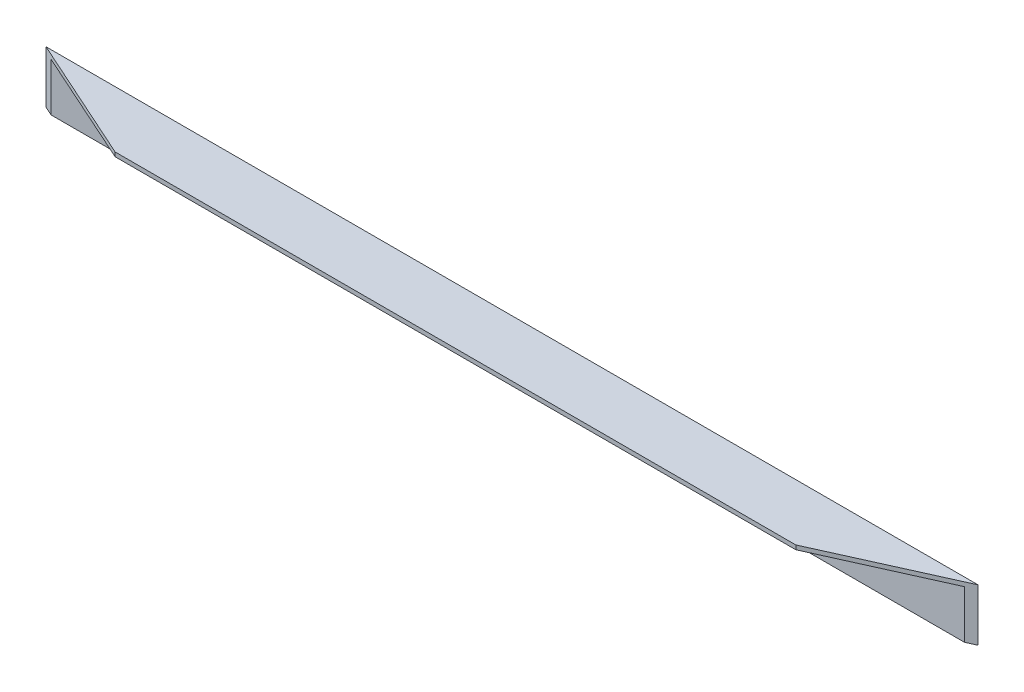
ISO-10303-21;
HEADER;
FILE_DESCRIPTION(('STEP AP214'),'2;1');
FILE_NAME('part.step','',(''),(''),'','','');
FILE_SCHEMA(('AUTOMOTIVE_DESIGN { 1 0 10303 214 1 1 1 1 }'));
ENDSEC;
DATA;
#1=APPLICATION_CONTEXT('core data for automotive mechanical design processes');
#2=APPLICATION_PROTOCOL_DEFINITION('international standard','automotive_design',2000,#1);
#3=PRODUCT_CONTEXT('',#1,'mechanical');
#4=PRODUCT('Part','Part','',(#3));
#5=PRODUCT_RELATED_PRODUCT_CATEGORY('part','',(#4));
#6=PRODUCT_DEFINITION_FORMATION('','',#4);
#7=PRODUCT_DEFINITION_CONTEXT('part definition',#1,'design');
#8=PRODUCT_DEFINITION('design','',#6,#7);
#9=PRODUCT_DEFINITION_SHAPE('','',#8);
#10=(LENGTH_UNIT() NAMED_UNIT(*) SI_UNIT(.MILLI.,.METRE.));
#11=(NAMED_UNIT(*) PLANE_ANGLE_UNIT() SI_UNIT($,.RADIAN.));
#12=(NAMED_UNIT(*) SI_UNIT($,.STERADIAN.) SOLID_ANGLE_UNIT());
#13=UNCERTAINTY_MEASURE_WITH_UNIT(LENGTH_MEASURE(1.E-05),#10,'distance_accuracy_value','');
#14=(GEOMETRIC_REPRESENTATION_CONTEXT(3) GLOBAL_UNCERTAINTY_ASSIGNED_CONTEXT((#13)) GLOBAL_UNIT_ASSIGNED_CONTEXT((#10,
#11,#12)) REPRESENTATION_CONTEXT('',''));
#15=CARTESIAN_POINT('',(0.,0.,0.));
#16=DIRECTION('',(0.,0.,1.));
#17=DIRECTION('',(1.,0.,0.));
#18=AXIS2_PLACEMENT_3D('',#15,#16,#17);
#19=CARTESIAN_POINT('',(-890.,100.,8.));
#20=DIRECTION('',(0.,0.,-1.));
#21=DIRECTION('',(-1.,0.,0.));
#22=AXIS2_PLACEMENT_3D('',#19,#20,#21);
#23=PLANE('',#22);
#24=DIRECTION('',(1.,0.,0.));
#25=VECTOR('',#24,1.);
#26=CARTESIAN_POINT('',(-890.,92.,8.));
#27=LINE('',#26,#25);
#28=CARTESIAN_POINT('',(-872.222222222222,92.,8.));
#29=VERTEX_POINT('',#28);
#30=CARTESIAN_POINT('',(872.222222222222,92.,8.));
#31=VERTEX_POINT('',#30);
#32=EDGE_CURVE('E36',#29,#31,#27,.T.);
#33=ORIENTED_EDGE('',*,*,#32,.F.);
#34=DIRECTION('',(0.,-1.,0.));
#35=VECTOR('',#34,1.);
#36=CARTESIAN_POINT('',(-872.222222222222,100.,8.));
#37=LINE('',#36,#35);
#38=CARTESIAN_POINT('',(-872.222222222222,0.,8.));
#39=VERTEX_POINT('',#38);
#40=EDGE_CURVE('E140',#29,#39,#37,.T.);
#41=ORIENTED_EDGE('',*,*,#40,.T.);
#42=DIRECTION('',(1.,0.,0.));
#43=VECTOR('',#42,1.);
#44=CARTESIAN_POINT('',(-890.,0.,8.));
#45=LINE('',#44,#43);
#46=CARTESIAN_POINT('',(872.222222222222,0.,8.));
#47=VERTEX_POINT('',#46);
#48=EDGE_CURVE('E109',#39,#47,#45,.T.);
#49=ORIENTED_EDGE('',*,*,#48,.T.);
#50=DIRECTION('',(0.,1.,0.));
#51=VECTOR('',#50,1.);
#52=CARTESIAN_POINT('',(872.222222222222,100.,8.));
#53=LINE('',#52,#51);
#54=EDGE_CURVE('E125',#47,#31,#53,.T.);
#55=ORIENTED_EDGE('',*,*,#54,.T.);
#56=EDGE_LOOP('',(#33,#41,#49,#55));
#57=FACE_BOUND('',#56,.T.);
#58=ADVANCED_FACE('F32',(#57),#23,.F.);
#59=CARTESIAN_POINT('',(-890.,0.,8.));
#60=DIRECTION('',(0.,1.,0.));
#61=DIRECTION('',(0.,0.,1.));
#62=AXIS2_PLACEMENT_3D('',#59,#60,#61);
#63=PLANE('',#62);
#64=ORIENTED_EDGE('',*,*,#48,.F.);
#65=DIRECTION('',(-0.911921505175107,0.,-0.410364677328798));
#66=VECTOR('',#65,1.);
#67=CARTESIAN_POINT('',(-887.006237006237,0.,1.34719334719335));
#68=LINE('',#67,#66);
#69=CARTESIAN_POINT('',(-890.,0.,0.));
#70=VERTEX_POINT('',#69);
#71=EDGE_CURVE('E129',#39,#70,#68,.T.);
#72=ORIENTED_EDGE('',*,*,#71,.T.);
#73=DIRECTION('',(1.,0.,0.));
#74=VECTOR('',#73,1.);
#75=CARTESIAN_POINT('',(-890.,0.,0.));
#76=LINE('',#75,#74);
#77=CARTESIAN_POINT('',(890.,0.,0.));
#78=VERTEX_POINT('',#77);
#79=EDGE_CURVE('E103',#70,#78,#76,.T.);
#80=ORIENTED_EDGE('',*,*,#79,.T.);
#81=DIRECTION('',(-0.911921505175107,0.,0.410364677328798));
#82=VECTOR('',#81,1.);
#83=CARTESIAN_POINT('',(-593.243243243243,0.,667.459459459459));
#84=LINE('',#83,#82);
#85=EDGE_CURVE('E127',#78,#47,#84,.T.);
#86=ORIENTED_EDGE('',*,*,#85,.T.);
#87=EDGE_LOOP('',(#64,#72,#80,#86));
#88=FACE_BOUND('',#87,.T.);
#89=ADVANCED_FACE('F34',(#88),#63,.F.);
#90=CARTESIAN_POINT('',(-890.,100.,8.));
#91=DIRECTION('',(0.,-1.,0.));
#92=DIRECTION('',(0.,0.,-1.));
#93=AXIS2_PLACEMENT_3D('',#90,#91,#92);
#94=PLANE('',#93);
#95=DIRECTION('',(-1.,0.,0.));
#96=VECTOR('',#95,1.);
#97=CARTESIAN_POINT('',(-890.,100.,0.));
#98=LINE('',#97,#96);
#99=CARTESIAN_POINT('',(890.,100.,0.));
#100=VERTEX_POINT('',#99);
#101=CARTESIAN_POINT('',(-890.,100.,0.));
#102=VERTEX_POINT('',#101);
#103=EDGE_CURVE('E96',#100,#102,#98,.T.);
#104=ORIENTED_EDGE('',*,*,#103,.T.);
#105=DIRECTION('',(-0.911921505175107,0.,-0.410364677328798));
#106=VECTOR('',#105,1.);
#107=CARTESIAN_POINT('',(-650.,100.,108.));
#108=LINE('',#107,#106);
#109=CARTESIAN_POINT('',(-650.,100.,108.));
#110=VERTEX_POINT('',#109);
#111=EDGE_CURVE('E86',#110,#102,#108,.T.);
#112=ORIENTED_EDGE('',*,*,#111,.F.);
#113=DIRECTION('',(-1.,0.,0.));
#114=VECTOR('',#113,1.);
#115=CARTESIAN_POINT('',(-890.,100.,108.));
#116=LINE('',#115,#114);
#117=CARTESIAN_POINT('',(650.,100.,108.));
#118=VERTEX_POINT('',#117);
#119=EDGE_CURVE('E94',#118,#110,#116,.T.);
#120=ORIENTED_EDGE('',*,*,#119,.F.);
#121=DIRECTION('',(-0.911921505175107,0.,0.410364677328798));
#122=VECTOR('',#121,1.);
#123=CARTESIAN_POINT('',(650.,100.,108.));
#124=LINE('',#123,#122);
#125=EDGE_CURVE('E56',#100,#118,#124,.T.);
#126=ORIENTED_EDGE('',*,*,#125,.F.);
#127=EDGE_LOOP('',(#104,#112,#120,#126));
#128=FACE_BOUND('',#127,.T.);
#129=ADVANCED_FACE('F93',(#128),#94,.F.);
#130=CARTESIAN_POINT('',(-890.,100.,0.));
#131=DIRECTION('',(0.,0.,-1.));
#132=DIRECTION('',(-1.,0.,0.));
#133=AXIS2_PLACEMENT_3D('',#130,#131,#132);
#134=PLANE('',#133);
#135=DIRECTION('',(0.,-1.,0.));
#136=VECTOR('',#135,1.);
#137=CARTESIAN_POINT('',(-890.,0.,0.));
#138=LINE('',#137,#136);
#139=EDGE_CURVE('E100',#102,#70,#138,.T.);
#140=ORIENTED_EDGE('',*,*,#139,.F.);
#141=ORIENTED_EDGE('',*,*,#103,.F.);
#142=DIRECTION('',(0.,1.,0.));
#143=VECTOR('',#142,1.);
#144=CARTESIAN_POINT('',(890.,0.,0.));
#145=LINE('',#144,#143);
#146=EDGE_CURVE('E113',#78,#100,#145,.T.);
#147=ORIENTED_EDGE('',*,*,#146,.F.);
#148=ORIENTED_EDGE('',*,*,#79,.F.);
#149=EDGE_LOOP('',(#140,#141,#147,#148));
#150=FACE_BOUND('',#149,.T.);
#151=ADVANCED_FACE('F144',(#150),#134,.T.);
#152=CARTESIAN_POINT('',(-890.,92.,108.));
#153=DIRECTION('',(0.,1.,0.));
#154=DIRECTION('',(0.,0.,1.));
#155=AXIS2_PLACEMENT_3D('',#152,#153,#154);
#156=PLANE('',#155);
#157=DIRECTION('',(1.,0.,0.));
#158=VECTOR('',#157,1.);
#159=CARTESIAN_POINT('',(-890.,92.,108.));
#160=LINE('',#159,#158);
#161=CARTESIAN_POINT('',(-650.,92.,108.));
#162=VERTEX_POINT('',#161);
#163=CARTESIAN_POINT('',(650.,92.,108.));
#164=VERTEX_POINT('',#163);
#165=EDGE_CURVE('E101',#162,#164,#160,.T.);
#166=ORIENTED_EDGE('',*,*,#165,.F.);
#167=DIRECTION('',(-0.911921505175107,0.,-0.410364677328798));
#168=VECTOR('',#167,1.);
#169=CARTESIAN_POINT('',(-849.5841995842,92.,18.1871101871102));
#170=LINE('',#169,#168);
#171=EDGE_CURVE('E48',#162,#29,#170,.T.);
#172=ORIENTED_EDGE('',*,*,#171,.T.);
#173=ORIENTED_EDGE('',*,*,#32,.T.);
#174=DIRECTION('',(-0.911921505175107,0.,0.410364677328798));
#175=VECTOR('',#174,1.);
#176=CARTESIAN_POINT('',(-630.665280665281,92.,684.299376299376));
#177=LINE('',#176,#175);
#178=EDGE_CURVE('E120',#31,#164,#177,.T.);
#179=ORIENTED_EDGE('',*,*,#178,.T.);
#180=EDGE_LOOP('',(#166,#172,#173,#179));
#181=FACE_BOUND('',#180,.T.);
#182=ADVANCED_FACE('F123',(#181),#156,.F.);
#183=CARTESIAN_POINT('',(-890.,92.,108.));
#184=DIRECTION('',(0.,0.,1.));
#185=DIRECTION('',(1.,0.,0.));
#186=AXIS2_PLACEMENT_3D('',#183,#184,#185);
#187=PLANE('',#186);
#188=DIRECTION('',(0.,1.,0.));
#189=VECTOR('',#188,1.);
#190=CARTESIAN_POINT('',(-650.,92.,108.));
#191=LINE('',#190,#189);
#192=EDGE_CURVE('E11',#162,#110,#191,.T.);
#193=ORIENTED_EDGE('',*,*,#192,.F.);
#194=ORIENTED_EDGE('',*,*,#165,.T.);
#195=DIRECTION('',(0.,-1.,0.));
#196=VECTOR('',#195,1.);
#197=CARTESIAN_POINT('',(650.,92.,108.));
#198=LINE('',#197,#196);
#199=EDGE_CURVE('E42',#118,#164,#198,.T.);
#200=ORIENTED_EDGE('',*,*,#199,.F.);
#201=ORIENTED_EDGE('',*,*,#119,.T.);
#202=EDGE_LOOP('',(#193,#194,#200,#201));
#203=FACE_BOUND('',#202,.T.);
#204=ADVANCED_FACE('F99',(#203),#187,.T.);
#205=CARTESIAN_POINT('',(650.,-2.50000000007189E-05,108.));
#206=DIRECTION('',(-0.410364677328798,0.,-0.911921505175107));
#207=DIRECTION('',(-0.911921505175107,0.,0.410364677328798));
#208=AXIS2_PLACEMENT_3D('',#205,#206,#207);
#209=PLANE('',#208);
#210=ORIENTED_EDGE('',*,*,#146,.T.);
#211=ORIENTED_EDGE('',*,*,#125,.T.);
#212=ORIENTED_EDGE('',*,*,#199,.T.);
#213=ORIENTED_EDGE('',*,*,#178,.F.);
#214=ORIENTED_EDGE('',*,*,#54,.F.);
#215=ORIENTED_EDGE('',*,*,#85,.F.);
#216=EDGE_LOOP('',(#210,#211,#212,#213,#214,#215));
#217=FACE_BOUND('',#216,.T.);
#218=ADVANCED_FACE('F118',(#217),#209,.F.);
#219=CARTESIAN_POINT('',(-650.,-2.50000000007189E-05,108.));
#220=DIRECTION('',(0.410364677328798,0.,-0.911921505175107));
#221=DIRECTION('',(-0.911921505175107,0.,-0.410364677328798));
#222=AXIS2_PLACEMENT_3D('',#219,#220,#221);
#223=PLANE('',#222);
#224=ORIENTED_EDGE('',*,*,#40,.F.);
#225=ORIENTED_EDGE('',*,*,#171,.F.);
#226=ORIENTED_EDGE('',*,*,#192,.T.);
#227=ORIENTED_EDGE('',*,*,#111,.T.);
#228=ORIENTED_EDGE('',*,*,#139,.T.);
#229=ORIENTED_EDGE('',*,*,#71,.F.);
#230=EDGE_LOOP('',(#224,#225,#226,#227,#228,#229));
#231=FACE_BOUND('',#230,.T.);
#232=ADVANCED_FACE('F85',(#231),#223,.F.);
#233=CLOSED_SHELL('',(#58,#89,#129,#151,#182,#204,#218,#232));
#234=MANIFOLD_SOLID_BREP('B2',#233);
#235=ADVANCED_BREP_SHAPE_REPRESENTATION('',(#18,#234),#14);
#236=SHAPE_DEFINITION_REPRESENTATION(#9,#235);
ENDSEC;
END-ISO-10303-21;
